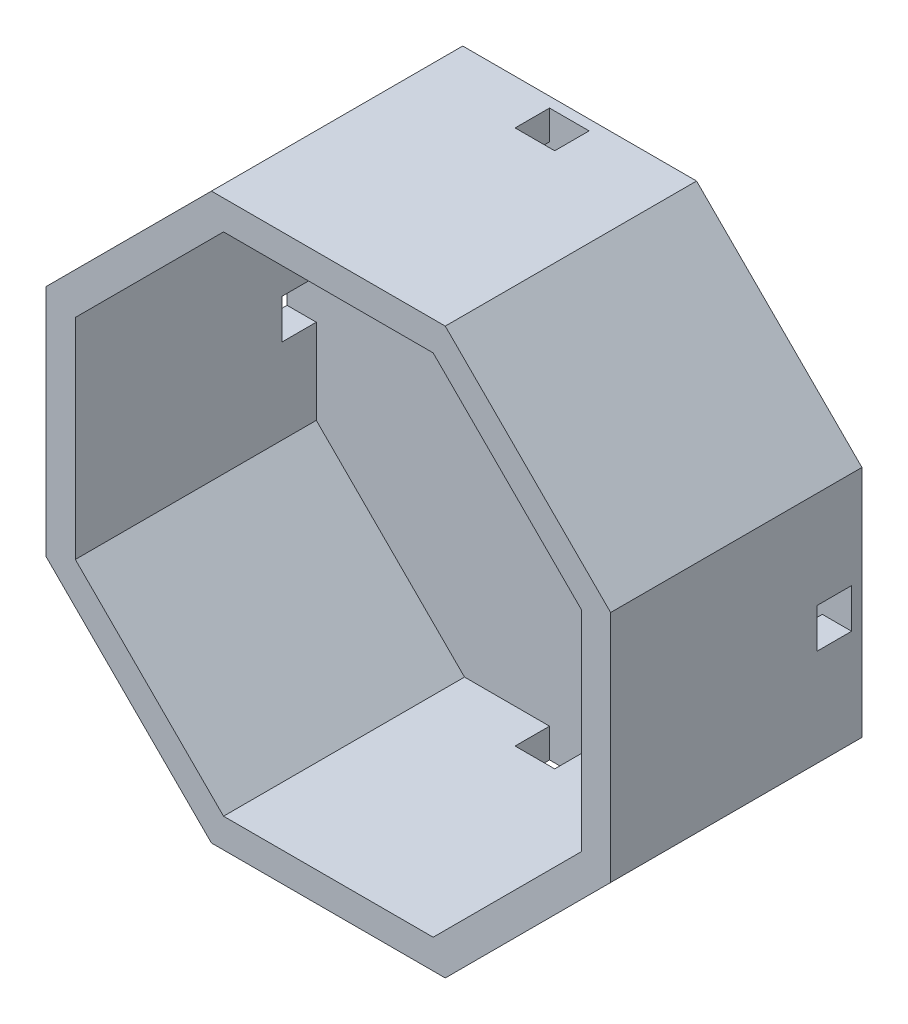
ISO-10303-21;
HEADER;
FILE_DESCRIPTION(('STEP AP214'),'2;1');
FILE_NAME('part.step','',(''),(''),'','','');
FILE_SCHEMA(('AUTOMOTIVE_DESIGN { 1 0 10303 214 1 1 1 1 }'));
ENDSEC;
DATA;
#1=APPLICATION_CONTEXT('core data for automotive mechanical design processes');
#2=APPLICATION_PROTOCOL_DEFINITION('international standard','automotive_design',2000,#1);
#3=PRODUCT_CONTEXT('',#1,'mechanical');
#4=PRODUCT('Part','Part','',(#3));
#5=PRODUCT_RELATED_PRODUCT_CATEGORY('part','',(#4));
#6=PRODUCT_DEFINITION_FORMATION('','',#4);
#7=PRODUCT_DEFINITION_CONTEXT('part definition',#1,'design');
#8=PRODUCT_DEFINITION('design','',#6,#7);
#9=PRODUCT_DEFINITION_SHAPE('','',#8);
#10=(LENGTH_UNIT() NAMED_UNIT(*) SI_UNIT(.MILLI.,.METRE.));
#11=(NAMED_UNIT(*) PLANE_ANGLE_UNIT() SI_UNIT($,.RADIAN.));
#12=(NAMED_UNIT(*) SI_UNIT($,.STERADIAN.) SOLID_ANGLE_UNIT());
#13=UNCERTAINTY_MEASURE_WITH_UNIT(LENGTH_MEASURE(1.E-05),#10,'distance_accuracy_value','');
#14=(GEOMETRIC_REPRESENTATION_CONTEXT(3) GLOBAL_UNCERTAINTY_ASSIGNED_CONTEXT((#13)) GLOBAL_UNIT_ASSIGNED_CONTEXT((#10,
#11,#12)) REPRESENTATION_CONTEXT('',''));
#15=CARTESIAN_POINT('',(0.,0.,0.));
#16=DIRECTION('',(0.,0.,1.));
#17=DIRECTION('',(1.,0.,0.));
#18=AXIS2_PLACEMENT_3D('',#15,#16,#17);
#19=CARTESIAN_POINT('',(0.,118.5,-33.4999999999997));
#20=DIRECTION('',(0.,1.,0.));
#21=DIRECTION('',(-1.,0.,0.));
#22=AXIS2_PLACEMENT_3D('',#19,#20,#21);
#23=PLANE('',#22);
#24=DIRECTION('',(1.,0.,0.));
#25=VECTOR('',#24,1.);
#26=CARTESIAN_POINT('',(0.,118.5,-36.4999999999997));
#27=LINE('',#26,#25);
#28=CARTESIAN_POINT('',(-33.9649975571363,118.5,-36.4999999999997));
#29=VERTEX_POINT('',#28);
#30=CARTESIAN_POINT('',(33.9650024428637,118.5,-36.4999999999997));
#31=VERTEX_POINT('',#30);
#32=EDGE_CURVE('E444',#29,#31,#27,.T.);
#33=ORIENTED_EDGE('',*,*,#32,.F.);
#34=DIRECTION('',(0.,0.,-1.));
#35=VECTOR('',#34,1.);
#36=CARTESIAN_POINT('',(-33.9649975571363,118.5,-33.4999999999997));
#37=LINE('',#36,#35);
#38=CARTESIAN_POINT('',(-33.9649975571363,118.5,36.5000000000003));
#39=VERTEX_POINT('',#38);
#40=EDGE_CURVE('E467',#39,#29,#37,.T.);
#41=ORIENTED_EDGE('',*,*,#40,.F.);
#42=DIRECTION('',(-1.,0.,0.));
#43=VECTOR('',#42,1.);
#44=CARTESIAN_POINT('',(0.,118.5,36.5000000000003));
#45=LINE('',#44,#43);
#46=CARTESIAN_POINT('',(33.9650024428637,118.5,36.5000000000003));
#47=VERTEX_POINT('',#46);
#48=EDGE_CURVE('E368',#47,#39,#45,.T.);
#49=ORIENTED_EDGE('',*,*,#48,.F.);
#50=DIRECTION('',(0.,0.,-1.));
#51=VECTOR('',#50,1.);
#52=CARTESIAN_POINT('',(33.9650024428637,118.5,-33.4999999999997));
#53=LINE('',#52,#51);
#54=EDGE_CURVE('E469',#47,#31,#53,.T.);
#55=ORIENTED_EDGE('',*,*,#54,.T.);
#56=EDGE_LOOP('',(#33,#41,#49,#55));
#57=FACE_BOUND('',#56,.T.);
#58=DIRECTION('',(-1.,0.,0.));
#59=VECTOR('',#58,1.);
#60=CARTESIAN_POINT('',(0.,118.5,-23.4999999999997));
#61=LINE('',#60,#59);
#62=CARTESIAN_POINT('',(5.75,118.5,-23.4999999999997));
#63=VERTEX_POINT('',#62);
#64=CARTESIAN_POINT('',(-5.75,118.5,-23.4999999999997));
#65=VERTEX_POINT('',#64);
#66=EDGE_CURVE('E258',#63,#65,#61,.T.);
#67=ORIENTED_EDGE('',*,*,#66,.T.);
#68=DIRECTION('',(0.,0.,-1.));
#69=VECTOR('',#68,1.);
#70=CARTESIAN_POINT('',(-5.75,118.5,-36.4999999999997));
#71=LINE('',#70,#69);
#72=CARTESIAN_POINT('',(-5.75,118.5,-33.4999999999997));
#73=VERTEX_POINT('',#72);
#74=EDGE_CURVE('E50',#65,#73,#71,.T.);
#75=ORIENTED_EDGE('',*,*,#74,.T.);
#76=DIRECTION('',(-1.,0.,0.));
#77=VECTOR('',#76,1.);
#78=CARTESIAN_POINT('',(0.,118.5,-33.4999999999997));
#79=LINE('',#78,#77);
#80=CARTESIAN_POINT('',(5.75,118.5,-33.4999999999997));
#81=VERTEX_POINT('',#80);
#82=EDGE_CURVE('E264',#81,#73,#79,.T.);
#83=ORIENTED_EDGE('',*,*,#82,.F.);
#84=DIRECTION('',(0.,0.,1.));
#85=VECTOR('',#84,1.);
#86=CARTESIAN_POINT('',(5.75,118.5,-36.4999999999997));
#87=LINE('',#86,#85);
#88=EDGE_CURVE('E249',#81,#63,#87,.T.);
#89=ORIENTED_EDGE('',*,*,#88,.T.);
#90=EDGE_LOOP('',(#67,#75,#83,#89));
#91=FACE_BOUND('',#90,.T.);
#92=ADVANCED_FACE('F35',(#57,#91),#23,.T.);
#93=CARTESIAN_POINT('',(0.,-45.4999999999999,-33.5000000000003));
#94=DIRECTION('',(0.,1.,0.));
#95=DIRECTION('',(-1.,0.,0.));
#96=AXIS2_PLACEMENT_3D('',#93,#94,#95);
#97=PLANE('',#96);
#98=DIRECTION('',(1.,0.,0.));
#99=VECTOR('',#98,1.);
#100=CARTESIAN_POINT('',(0.,-45.4999999999999,-36.5000000000003));
#101=LINE('',#100,#99);
#102=CARTESIAN_POINT('',(-33.9649975571363,-45.4999999999999,-36.5000000000003));
#103=VERTEX_POINT('',#102);
#104=CARTESIAN_POINT('',(33.9650024428637,-45.4999999999999,-36.5000000000003));
#105=VERTEX_POINT('',#104);
#106=EDGE_CURVE('E454',#103,#105,#101,.T.);
#107=ORIENTED_EDGE('',*,*,#106,.T.);
#108=DIRECTION('',(0.,0.,-1.));
#109=VECTOR('',#108,1.);
#110=CARTESIAN_POINT('',(33.9650024428637,-45.4999999999999,-33.5000000000003));
#111=LINE('',#110,#109);
#112=CARTESIAN_POINT('',(33.9650024428637,-45.5000000000001,36.4999999999997));
#113=VERTEX_POINT('',#112);
#114=EDGE_CURVE('E456',#113,#105,#111,.T.);
#115=ORIENTED_EDGE('',*,*,#114,.F.);
#116=DIRECTION('',(1.,0.,0.));
#117=VECTOR('',#116,1.);
#118=CARTESIAN_POINT('',(0.,-45.5000000000001,36.4999999999997));
#119=LINE('',#118,#117);
#120=CARTESIAN_POINT('',(-33.9649975571363,-45.5000000000001,36.4999999999997));
#121=VERTEX_POINT('',#120);
#122=EDGE_CURVE('E380',#121,#113,#119,.T.);
#123=ORIENTED_EDGE('',*,*,#122,.F.);
#124=DIRECTION('',(0.,0.,-1.));
#125=VECTOR('',#124,1.);
#126=CARTESIAN_POINT('',(-33.9649975571363,-45.4999999999999,-33.5000000000003));
#127=LINE('',#126,#125);
#128=EDGE_CURVE('E459',#121,#103,#127,.T.);
#129=ORIENTED_EDGE('',*,*,#128,.T.);
#130=EDGE_LOOP('',(#107,#115,#123,#129));
#131=FACE_BOUND('',#130,.T.);
#132=DIRECTION('',(0.,0.,-1.));
#133=VECTOR('',#132,1.);
#134=CARTESIAN_POINT('',(-5.75,-45.4999999999999,-33.5000000000003));
#135=LINE('',#134,#133);
#136=CARTESIAN_POINT('',(-5.75,-45.4999999999999,-23.5000000000003));
#137=VERTEX_POINT('',#136);
#138=CARTESIAN_POINT('',(-5.75,-45.4999999999999,-33.5000000000003));
#139=VERTEX_POINT('',#138);
#140=EDGE_CURVE('E287',#137,#139,#135,.T.);
#141=ORIENTED_EDGE('',*,*,#140,.F.);
#142=DIRECTION('',(-1.,0.,0.));
#143=VECTOR('',#142,1.);
#144=CARTESIAN_POINT('',(0.,-45.4999999999999,-23.5000000000003));
#145=LINE('',#144,#143);
#146=CARTESIAN_POINT('',(5.75,-45.4999999999999,-23.5000000000003));
#147=VERTEX_POINT('',#146);
#148=EDGE_CURVE('E291',#147,#137,#145,.T.);
#149=ORIENTED_EDGE('',*,*,#148,.F.);
#150=DIRECTION('',(0.,0.,1.));
#151=VECTOR('',#150,1.);
#152=CARTESIAN_POINT('',(5.75,-45.4999999999999,-33.5000000000003));
#153=LINE('',#152,#151);
#154=CARTESIAN_POINT('',(5.75,-45.4999999999999,-33.5000000000003));
#155=VERTEX_POINT('',#154);
#156=EDGE_CURVE('E280',#155,#147,#153,.T.);
#157=ORIENTED_EDGE('',*,*,#156,.F.);
#158=DIRECTION('',(-1.,0.,0.));
#159=VECTOR('',#158,1.);
#160=CARTESIAN_POINT('',(0.,-45.4999999999999,-33.5000000000003));
#161=LINE('',#160,#159);
#162=EDGE_CURVE('E293',#155,#139,#161,.T.);
#163=ORIENTED_EDGE('',*,*,#162,.T.);
#164=EDGE_LOOP('',(#141,#149,#157,#163));
#165=FACE_BOUND('',#164,.T.);
#166=ADVANCED_FACE('F528',(#131,#165),#97,.F.);
#167=CARTESIAN_POINT('',(0.,110.,36.5000000000003));
#168=DIRECTION('',(0.,1.,0.));
#169=DIRECTION('',(-1.,0.,0.));
#170=AXIS2_PLACEMENT_3D('',#167,#168,#169);
#171=PLANE('',#170);
#172=DIRECTION('',(0.,0.,-1.));
#173=VECTOR('',#172,1.);
#174=CARTESIAN_POINT('',(-5.74999999999999,110.,36.5000000000003));
#175=LINE('',#174,#173);
#176=CARTESIAN_POINT('',(-5.75,110.,-23.4999999999997));
#177=VERTEX_POINT('',#176);
#178=CARTESIAN_POINT('',(-5.75,110.,-33.4999999999997));
#179=VERTEX_POINT('',#178);
#180=EDGE_CURVE('E285',#177,#179,#175,.T.);
#181=ORIENTED_EDGE('',*,*,#180,.F.);
#182=DIRECTION('',(-1.,0.,0.));
#183=VECTOR('',#182,1.);
#184=CARTESIAN_POINT('',(0.,110.,-23.4999999999997));
#185=LINE('',#184,#183);
#186=CARTESIAN_POINT('',(5.75,110.,-23.4999999999997));
#187=VERTEX_POINT('',#186);
#188=EDGE_CURVE('E289',#187,#177,#185,.T.);
#189=ORIENTED_EDGE('',*,*,#188,.F.);
#190=DIRECTION('',(0.,0.,1.));
#191=VECTOR('',#190,1.);
#192=CARTESIAN_POINT('',(5.75000000000001,110.,36.5000000000003));
#193=LINE('',#192,#191);
#194=CARTESIAN_POINT('',(5.75,110.,-33.4999999999997));
#195=VERTEX_POINT('',#194);
#196=EDGE_CURVE('E252',#195,#187,#193,.T.);
#197=ORIENTED_EDGE('',*,*,#196,.F.);
#198=DIRECTION('',(1.,0.,0.));
#199=VECTOR('',#198,1.);
#200=CARTESIAN_POINT('',(0.,110.,-33.4999999999997));
#201=LINE('',#200,#199);
#202=CARTESIAN_POINT('',(30.4441847198287,110.,-33.4999999999997));
#203=VERTEX_POINT('',#202);
#204=EDGE_CURVE('E344',#195,#203,#201,.T.);
#205=ORIENTED_EDGE('',*,*,#204,.T.);
#206=DIRECTION('',(0.,0.,-1.));
#207=VECTOR('',#206,1.);
#208=CARTESIAN_POINT('',(30.4441847198287,110.,36.5000000000003));
#209=LINE('',#208,#207);
#210=CARTESIAN_POINT('',(30.4441847198287,110.,36.5000000000003));
#211=VERTEX_POINT('',#210);
#212=EDGE_CURVE('E432',#211,#203,#209,.T.);
#213=ORIENTED_EDGE('',*,*,#212,.F.);
#214=DIRECTION('',(1.,0.,0.));
#215=VECTOR('',#214,1.);
#216=CARTESIAN_POINT('',(0.,110.,36.5000000000003));
#217=LINE('',#216,#215);
#218=CARTESIAN_POINT('',(-30.4441847198287,110.,36.5000000000003));
#219=VERTEX_POINT('',#218);
#220=EDGE_CURVE('E345',#219,#211,#217,.T.);
#221=ORIENTED_EDGE('',*,*,#220,.F.);
#222=DIRECTION('',(0.,0.,-1.));
#223=VECTOR('',#222,1.);
#224=CARTESIAN_POINT('',(-30.4441847198287,110.,36.5000000000003));
#225=LINE('',#224,#223);
#226=CARTESIAN_POINT('',(-30.4441847198287,110.,-33.4999999999997));
#227=VERTEX_POINT('',#226);
#228=EDGE_CURVE('E389',#219,#227,#225,.T.);
#229=ORIENTED_EDGE('',*,*,#228,.T.);
#230=EDGE_CURVE('E390',#227,#179,#201,.T.);
#231=ORIENTED_EDGE('',*,*,#230,.T.);
#232=EDGE_LOOP('',(#181,#189,#197,#205,#213,#221,#229,#231));
#233=FACE_BOUND('',#232,.T.);
#234=ADVANCED_FACE('F567',(#233),#171,.F.);
#235=CARTESIAN_POINT('',(0.,-37.0000000000001,36.4999999999998));
#236=DIRECTION('',(0.,1.,0.));
#237=DIRECTION('',(-1.,0.,0.));
#238=AXIS2_PLACEMENT_3D('',#235,#236,#237);
#239=PLANE('',#238);
#240=DIRECTION('',(-1.,0.,0.));
#241=VECTOR('',#240,1.);
#242=CARTESIAN_POINT('',(0.,-36.9999999999999,-23.5000000000003));
#243=LINE('',#242,#241);
#244=CARTESIAN_POINT('',(5.75,-36.9999999999999,-23.5000000000003));
#245=VERTEX_POINT('',#244);
#246=CARTESIAN_POINT('',(-5.75,-36.9999999999999,-23.5000000000003));
#247=VERTEX_POINT('',#246);
#248=EDGE_CURVE('E11',#245,#247,#243,.T.);
#249=ORIENTED_EDGE('',*,*,#248,.T.);
#250=DIRECTION('',(0.,0.,-1.));
#251=VECTOR('',#250,1.);
#252=CARTESIAN_POINT('',(-5.74999999999999,-37.0000000000001,36.4999999999998));
#253=LINE('',#252,#251);
#254=CARTESIAN_POINT('',(-5.75,-36.9999999999999,-33.5000000000003));
#255=VERTEX_POINT('',#254);
#256=EDGE_CURVE('E282',#247,#255,#253,.T.);
#257=ORIENTED_EDGE('',*,*,#256,.T.);
#258=DIRECTION('',(1.,0.,0.));
#259=VECTOR('',#258,1.);
#260=CARTESIAN_POINT('',(0.,-36.9999999999999,-33.5000000000003));
#261=LINE('',#260,#259);
#262=CARTESIAN_POINT('',(-30.4441847198286,-36.9999999999999,-33.5000000000003));
#263=VERTEX_POINT('',#262);
#264=EDGE_CURVE('E404',#263,#255,#261,.T.);
#265=ORIENTED_EDGE('',*,*,#264,.F.);
#266=DIRECTION('',(0.,0.,-1.));
#267=VECTOR('',#266,1.);
#268=CARTESIAN_POINT('',(-30.4441847198286,-37.0000000000001,36.4999999999998));
#269=LINE('',#268,#267);
#270=CARTESIAN_POINT('',(-30.4441847198286,-37.0000000000001,36.4999999999998));
#271=VERTEX_POINT('',#270);
#272=EDGE_CURVE('E422',#271,#263,#269,.T.);
#273=ORIENTED_EDGE('',*,*,#272,.F.);
#274=DIRECTION('',(1.,0.,0.));
#275=VECTOR('',#274,1.);
#276=CARTESIAN_POINT('',(0.,-37.0000000000001,36.4999999999998));
#277=LINE('',#276,#275);
#278=CARTESIAN_POINT('',(30.4441847198287,-37.0000000000001,36.4999999999998));
#279=VERTEX_POINT('',#278);
#280=EDGE_CURVE('E356',#271,#279,#277,.T.);
#281=ORIENTED_EDGE('',*,*,#280,.T.);
#282=DIRECTION('',(0.,0.,-1.));
#283=VECTOR('',#282,1.);
#284=CARTESIAN_POINT('',(30.4441847198287,-37.0000000000001,36.4999999999998));
#285=LINE('',#284,#283);
#286=CARTESIAN_POINT('',(30.4441847198287,-36.9999999999999,-33.5000000000003));
#287=VERTEX_POINT('',#286);
#288=EDGE_CURVE('E424',#279,#287,#285,.T.);
#289=ORIENTED_EDGE('',*,*,#288,.T.);
#290=CARTESIAN_POINT('',(5.75,-36.9999999999999,-33.5000000000003));
#291=VERTEX_POINT('',#290);
#292=EDGE_CURVE('E403',#291,#287,#261,.T.);
#293=ORIENTED_EDGE('',*,*,#292,.F.);
#294=DIRECTION('',(0.,0.,1.));
#295=VECTOR('',#294,1.);
#296=CARTESIAN_POINT('',(5.75000000000001,-37.0000000000001,36.4999999999998));
#297=LINE('',#296,#295);
#298=EDGE_CURVE('E276',#291,#245,#297,.T.);
#299=ORIENTED_EDGE('',*,*,#298,.T.);
#300=EDGE_LOOP('',(#249,#257,#265,#273,#281,#289,#293,#299));
#301=FACE_BOUND('',#300,.T.);
#302=ADVANCED_FACE('F518',(#301),#239,.T.);
#303=CARTESIAN_POINT('',(57.9825020850924,-21.4824991363393,-33.5000000000002));
#304=DIRECTION('',(-0.707106799166828,0.707106763206266,0.));
#305=DIRECTION('',(-0.707106763206267,-0.707106799166828,0.));
#306=AXIS2_PLACEMENT_3D('',#303,#304,#305);
#307=PLANE('',#306);
#308=DIRECTION('',(0.707106763206267,0.707106799166828,0.));
#309=VECTOR('',#308,1.);
#310=CARTESIAN_POINT('',(57.9825020850924,-21.4824991363392,-36.5000000000002));
#311=LINE('',#310,#309);
#312=CARTESIAN_POINT('',(82.,2.5350000000002,-36.5000000000001));
#313=VERTEX_POINT('',#312);
#314=EDGE_CURVE('E435',#105,#313,#311,.T.);
#315=ORIENTED_EDGE('',*,*,#314,.T.);
#316=DIRECTION('',(0.,0.,-1.));
#317=VECTOR('',#316,1.);
#318=CARTESIAN_POINT('',(82.,2.53500000000019,-33.5000000000001));
#319=LINE('',#318,#317);
#320=CARTESIAN_POINT('',(82.,2.53499999999995,36.4999999999999));
#321=VERTEX_POINT('',#320);
#322=EDGE_CURVE('E473',#321,#313,#319,.T.);
#323=ORIENTED_EDGE('',*,*,#322,.F.);
#324=DIRECTION('',(0.707106763206267,0.707106799166828,0.));
#325=VECTOR('',#324,1.);
#326=CARTESIAN_POINT('',(57.9825020850925,-21.4824991363395,36.4999999999998));
#327=LINE('',#326,#325);
#328=EDGE_CURVE('E383',#113,#321,#327,.T.);
#329=ORIENTED_EDGE('',*,*,#328,.F.);
#330=ORIENTED_EDGE('',*,*,#114,.T.);
#331=EDGE_LOOP('',(#315,#323,#329,#330));
#332=FACE_BOUND('',#331,.T.);
#333=ADVANCED_FACE('F37',(#332),#307,.F.);
#334=CARTESIAN_POINT('',(82.,36.5000000000001,-33.5));
#335=DIRECTION('',(1.,0.,0.));
#336=DIRECTION('',(0.,1.,0.));
#337=AXIS2_PLACEMENT_3D('',#334,#335,#336);
#338=PLANE('',#337);
#339=DIRECTION('',(0.,-1.,0.));
#340=VECTOR('',#339,1.);
#341=CARTESIAN_POINT('',(82.,36.5000000000001,-23.5));
#342=LINE('',#341,#340);
#343=CARTESIAN_POINT('',(82.,42.2500000000001,-23.5));
#344=VERTEX_POINT('',#343);
#345=CARTESIAN_POINT('',(82.,30.7500000000001,-23.5));
#346=VERTEX_POINT('',#345);
#347=EDGE_CURVE('E296',#344,#346,#342,.T.);
#348=ORIENTED_EDGE('',*,*,#347,.F.);
#349=DIRECTION('',(0.,0.,1.));
#350=VECTOR('',#349,1.);
#351=CARTESIAN_POINT('',(82.,42.2500000000001,-36.5));
#352=LINE('',#351,#350);
#353=CARTESIAN_POINT('',(82.,42.2500000000001,-33.5));
#354=VERTEX_POINT('',#353);
#355=EDGE_CURVE('E304',#354,#344,#352,.T.);
#356=ORIENTED_EDGE('',*,*,#355,.F.);
#357=DIRECTION('',(0.,1.,0.));
#358=VECTOR('',#357,1.);
#359=CARTESIAN_POINT('',(82.,36.5000000000001,-33.5));
#360=LINE('',#359,#358);
#361=CARTESIAN_POINT('',(82.,30.7500000000001,-33.5));
#362=VERTEX_POINT('',#361);
#363=EDGE_CURVE('E301',#362,#354,#360,.T.);
#364=ORIENTED_EDGE('',*,*,#363,.F.);
#365=DIRECTION('',(0.,0.,-1.));
#366=VECTOR('',#365,1.);
#367=CARTESIAN_POINT('',(82.,30.7500000000001,-36.5));
#368=LINE('',#367,#366);
#369=EDGE_CURVE('E298',#346,#362,#368,.T.);
#370=ORIENTED_EDGE('',*,*,#369,.F.);
#371=EDGE_LOOP('',(#348,#356,#364,#370));
#372=FACE_BOUND('',#371,.T.);
#373=DIRECTION('',(0.,-1.,0.));
#374=VECTOR('',#373,1.);
#375=CARTESIAN_POINT('',(82.,36.5000000000001,-36.5));
#376=LINE('',#375,#374);
#377=CARTESIAN_POINT('',(82.,70.4650000000001,-36.4999999999999));
#378=VERTEX_POINT('',#377);
#379=EDGE_CURVE('E438',#378,#313,#376,.T.);
#380=ORIENTED_EDGE('',*,*,#379,.F.);
#381=DIRECTION('',(0.,0.,-1.));
#382=VECTOR('',#381,1.);
#383=CARTESIAN_POINT('',(82.,70.4650000000001,-33.4999999999999));
#384=LINE('',#383,#382);
#385=CARTESIAN_POINT('',(82.,70.4649999999999,36.5000000000001));
#386=VERTEX_POINT('',#385);
#387=EDGE_CURVE('E471',#386,#378,#384,.T.);
#388=ORIENTED_EDGE('',*,*,#387,.F.);
#389=DIRECTION('',(0.,1.,0.));
#390=VECTOR('',#389,1.);
#391=CARTESIAN_POINT('',(82.,36.4999999999999,36.5));
#392=LINE('',#391,#390);
#393=EDGE_CURVE('E386',#321,#386,#392,.T.);
#394=ORIENTED_EDGE('',*,*,#393,.F.);
#395=ORIENTED_EDGE('',*,*,#322,.T.);
#396=EDGE_LOOP('',(#380,#388,#394,#395));
#397=FACE_BOUND('',#396,.T.);
#398=ADVANCED_FACE('F554',(#372,#397),#338,.T.);
#399=CARTESIAN_POINT('',(57.9825020850924,94.4824991363396,-33.4999999999998));
#400=DIRECTION('',(0.707106799166828,0.707106763206267,0.));
#401=DIRECTION('',(-0.707106763206267,0.707106799166828,0.));
#402=AXIS2_PLACEMENT_3D('',#399,#400,#401);
#403=PLANE('',#402);
#404=DIRECTION('',(0.707106763206267,-0.707106799166828,0.));
#405=VECTOR('',#404,1.);
#406=CARTESIAN_POINT('',(57.9825020850924,94.4824991363396,-36.4999999999998));
#407=LINE('',#406,#405);
#408=EDGE_CURVE('E441',#31,#378,#407,.T.);
#409=ORIENTED_EDGE('',*,*,#408,.F.);
#410=ORIENTED_EDGE('',*,*,#54,.F.);
#411=DIRECTION('',(-0.707106763206267,0.707106799166828,0.));
#412=VECTOR('',#411,1.);
#413=CARTESIAN_POINT('',(57.9825020850924,94.4824991363393,36.5000000000002));
#414=LINE('',#413,#412);
#415=EDGE_CURVE('E365',#386,#47,#414,.T.);
#416=ORIENTED_EDGE('',*,*,#415,.F.);
#417=ORIENTED_EDGE('',*,*,#387,.T.);
#418=EDGE_LOOP('',(#409,#410,#416,#417));
#419=FACE_BOUND('',#418,.T.);
#420=ADVANCED_FACE('F594',(#419),#403,.T.);
#421=CARTESIAN_POINT('',(-57.9824979149076,94.4825008636606,-33.4999999999998));
#422=DIRECTION('',(-0.707106763206267,0.707106799166827,0.));
#423=DIRECTION('',(-0.707106799166827,-0.707106763206268,0.));
#424=AXIS2_PLACEMENT_3D('',#421,#422,#423);
#425=PLANE('',#424);
#426=DIRECTION('',(0.707106799166827,0.707106763206268,0.));
#427=VECTOR('',#426,1.);
#428=CARTESIAN_POINT('',(-57.9824979149076,94.4825008636606,-36.4999999999998));
#429=LINE('',#428,#427);
#430=CARTESIAN_POINT('',(-82.,70.4650000000001,-36.4999999999999));
#431=VERTEX_POINT('',#430);
#432=EDGE_CURVE('E447',#431,#29,#429,.T.);
#433=ORIENTED_EDGE('',*,*,#432,.F.);
#434=DIRECTION('',(0.,0.,-1.));
#435=VECTOR('',#434,1.);
#436=CARTESIAN_POINT('',(-82.,70.4650000000001,-33.4999999999999));
#437=LINE('',#436,#435);
#438=CARTESIAN_POINT('',(-82.,70.4649999999999,36.5000000000001));
#439=VERTEX_POINT('',#438);
#440=EDGE_CURVE('E465',#439,#431,#437,.T.);
#441=ORIENTED_EDGE('',*,*,#440,.F.);
#442=DIRECTION('',(-0.707106799166827,-0.707106763206268,0.));
#443=VECTOR('',#442,1.);
#444=CARTESIAN_POINT('',(-57.9824979149076,94.4825008636603,36.5000000000002));
#445=LINE('',#444,#443);
#446=EDGE_CURVE('E371',#39,#439,#445,.T.);
#447=ORIENTED_EDGE('',*,*,#446,.F.);
#448=ORIENTED_EDGE('',*,*,#40,.T.);
#449=EDGE_LOOP('',(#433,#441,#447,#448));
#450=FACE_BOUND('',#449,.T.);
#451=ADVANCED_FACE('F592',(#450),#425,.T.);
#452=CARTESIAN_POINT('',(-82.,36.5000000000001,-33.5));
#453=DIRECTION('',(1.,0.,0.));
#454=DIRECTION('',(0.,1.,0.));
#455=AXIS2_PLACEMENT_3D('',#452,#453,#454);
#456=PLANE('',#455);
#457=DIRECTION('',(0.,0.,1.));
#458=VECTOR('',#457,1.);
#459=CARTESIAN_POINT('',(-82.,42.2500000000001,-33.5));
#460=LINE('',#459,#458);
#461=CARTESIAN_POINT('',(-82.,42.2500000000001,-33.5));
#462=VERTEX_POINT('',#461);
#463=CARTESIAN_POINT('',(-82.,42.2500000000001,-23.5));
#464=VERTEX_POINT('',#463);
#465=EDGE_CURVE('E333',#462,#464,#460,.T.);
#466=ORIENTED_EDGE('',*,*,#465,.T.);
#467=DIRECTION('',(0.,-1.,0.));
#468=VECTOR('',#467,1.);
#469=CARTESIAN_POINT('',(-82.,36.5000000000001,-23.5));
#470=LINE('',#469,#468);
#471=CARTESIAN_POINT('',(-82.,30.7500000000001,-23.5));
#472=VERTEX_POINT('',#471);
#473=EDGE_CURVE('E341',#464,#472,#470,.T.);
#474=ORIENTED_EDGE('',*,*,#473,.T.);
#475=DIRECTION('',(0.,0.,-1.));
#476=VECTOR('',#475,1.);
#477=CARTESIAN_POINT('',(-82.,30.7500000000001,-33.5));
#478=LINE('',#477,#476);
#479=CARTESIAN_POINT('',(-82.,30.7500000000001,-33.5));
#480=VERTEX_POINT('',#479);
#481=EDGE_CURVE('E325',#472,#480,#478,.T.);
#482=ORIENTED_EDGE('',*,*,#481,.T.);
#483=DIRECTION('',(0.,1.,0.));
#484=VECTOR('',#483,1.);
#485=CARTESIAN_POINT('',(-82.,36.5000000000001,-33.5));
#486=LINE('',#485,#484);
#487=EDGE_CURVE('E336',#480,#462,#486,.T.);
#488=ORIENTED_EDGE('',*,*,#487,.T.);
#489=EDGE_LOOP('',(#466,#474,#482,#488));
#490=FACE_BOUND('',#489,.T.);
#491=DIRECTION('',(0.,-1.,0.));
#492=VECTOR('',#491,1.);
#493=CARTESIAN_POINT('',(-82.,36.5000000000001,-36.5));
#494=LINE('',#493,#492);
#495=CARTESIAN_POINT('',(-82.,2.53500000000013,-36.5000000000001));
#496=VERTEX_POINT('',#495);
#497=EDGE_CURVE('E450',#431,#496,#494,.T.);
#498=ORIENTED_EDGE('',*,*,#497,.T.);
#499=DIRECTION('',(0.,0.,-1.));
#500=VECTOR('',#499,1.);
#501=CARTESIAN_POINT('',(-82.,2.53500000000011,-33.5000000000001));
#502=LINE('',#501,#500);
#503=CARTESIAN_POINT('',(-82.,2.53499999999985,36.4999999999999));
#504=VERTEX_POINT('',#503);
#505=EDGE_CURVE('E462',#504,#496,#502,.T.);
#506=ORIENTED_EDGE('',*,*,#505,.F.);
#507=DIRECTION('',(0.,-1.,0.));
#508=VECTOR('',#507,1.);
#509=CARTESIAN_POINT('',(-82.,36.4999999999999,36.5));
#510=LINE('',#509,#508);
#511=EDGE_CURVE('E374',#439,#504,#510,.T.);
#512=ORIENTED_EDGE('',*,*,#511,.F.);
#513=ORIENTED_EDGE('',*,*,#440,.T.);
#514=EDGE_LOOP('',(#498,#506,#512,#513));
#515=FACE_BOUND('',#514,.T.);
#516=ADVANCED_FACE('F488',(#490,#515),#456,.F.);
#517=CARTESIAN_POINT('',(-57.9824979149077,-21.4825008636603,-33.5000000000002));
#518=DIRECTION('',(0.707106763206268,0.707106799166827,0.));
#519=DIRECTION('',(-0.707106799166827,0.707106763206268,0.));
#520=AXIS2_PLACEMENT_3D('',#517,#518,#519);
#521=PLANE('',#520);
#522=DIRECTION('',(0.707106799166827,-0.707106763206268,0.));
#523=VECTOR('',#522,1.);
#524=CARTESIAN_POINT('',(-57.9824979149077,-21.4825008636603,-36.5000000000002));
#525=LINE('',#524,#523);
#526=EDGE_CURVE('E452',#496,#103,#525,.T.);
#527=ORIENTED_EDGE('',*,*,#526,.T.);
#528=ORIENTED_EDGE('',*,*,#128,.F.);
#529=DIRECTION('',(0.707106799166827,-0.707106763206268,0.));
#530=VECTOR('',#529,1.);
#531=CARTESIAN_POINT('',(-57.9824979149077,-21.4825008636606,36.4999999999998));
#532=LINE('',#531,#530);
#533=EDGE_CURVE('E377',#504,#121,#532,.T.);
#534=ORIENTED_EDGE('',*,*,#533,.F.);
#535=ORIENTED_EDGE('',*,*,#505,.T.);
#536=EDGE_LOOP('',(#527,#528,#534,#535));
#537=FACE_BOUND('',#536,.T.);
#538=ADVANCED_FACE('F623',(#537),#521,.F.);
#539=CARTESIAN_POINT('',(0.,36.5000000000001,-36.5));
#540=DIRECTION('',(0.,0.,1.));
#541=DIRECTION('',(0.,-1.,0.));
#542=AXIS2_PLACEMENT_3D('',#539,#540,#541);
#543=PLANE('',#542);
#544=ORIENTED_EDGE('',*,*,#314,.F.);
#545=ORIENTED_EDGE('',*,*,#106,.F.);
#546=ORIENTED_EDGE('',*,*,#526,.F.);
#547=ORIENTED_EDGE('',*,*,#497,.F.);
#548=ORIENTED_EDGE('',*,*,#432,.T.);
#549=ORIENTED_EDGE('',*,*,#32,.T.);
#550=ORIENTED_EDGE('',*,*,#408,.T.);
#551=ORIENTED_EDGE('',*,*,#379,.T.);
#552=EDGE_LOOP('',(#544,#545,#546,#547,#548,#549,#550,#551));
#553=FACE_BOUND('',#552,.T.);
#554=ADVANCED_FACE('F611',(#553),#543,.F.);
#555=CARTESIAN_POINT('',(51.9720923599143,88.4720923599142,36.5000000000002));
#556=DIRECTION('',(0.707106781186548,0.707106781186548,0.));
#557=DIRECTION('',(-0.707106781186547,0.707106781186548,0.));
#558=AXIS2_PLACEMENT_3D('',#555,#556,#557);
#559=PLANE('',#558);
#560=DIRECTION('',(0.707106781186547,-0.707106781186548,0.));
#561=VECTOR('',#560,1.);
#562=CARTESIAN_POINT('',(51.9720923599143,88.4720923599145,-33.4999999999998));
#563=LINE('',#562,#561);
#564=CARTESIAN_POINT('',(73.5,66.9441847198288,-33.4999999999999));
#565=VERTEX_POINT('',#564);
#566=EDGE_CURVE('E393',#203,#565,#563,.T.);
#567=ORIENTED_EDGE('',*,*,#566,.T.);
#568=DIRECTION('',(0.,0.,-1.));
#569=VECTOR('',#568,1.);
#570=CARTESIAN_POINT('',(73.5,66.9441847198286,36.5000000000001));
#571=LINE('',#570,#569);
#572=CARTESIAN_POINT('',(73.5,66.9441847198286,36.5000000000001));
#573=VERTEX_POINT('',#572);
#574=EDGE_CURVE('E429',#573,#565,#571,.T.);
#575=ORIENTED_EDGE('',*,*,#574,.F.);
#576=DIRECTION('',(0.707106781186547,-0.707106781186548,0.));
#577=VECTOR('',#576,1.);
#578=CARTESIAN_POINT('',(51.9720923599143,88.4720923599142,36.5000000000002));
#579=LINE('',#578,#577);
#580=EDGE_CURVE('E348',#211,#573,#579,.T.);
#581=ORIENTED_EDGE('',*,*,#580,.F.);
#582=ORIENTED_EDGE('',*,*,#212,.T.);
#583=EDGE_LOOP('',(#567,#575,#581,#582));
#584=FACE_BOUND('',#583,.T.);
#585=ADVANCED_FACE('F564',(#584),#559,.F.);
#586=CARTESIAN_POINT('',(73.5,36.4999999999999,36.5));
#587=DIRECTION('',(-1.,0.,0.));
#588=DIRECTION('',(0.,-1.,0.));
#589=AXIS2_PLACEMENT_3D('',#586,#587,#588);
#590=PLANE('',#589);
#591=DIRECTION('',(0.,0.,-1.));
#592=VECTOR('',#591,1.);
#593=CARTESIAN_POINT('',(73.5,42.2499999999999,36.5));
#594=LINE('',#593,#592);
#595=CARTESIAN_POINT('',(73.5,42.2500000000001,-23.5));
#596=VERTEX_POINT('',#595);
#597=CARTESIAN_POINT('',(73.5,42.2500000000001,-33.5));
#598=VERTEX_POINT('',#597);
#599=EDGE_CURVE('E331',#596,#598,#594,.T.);
#600=ORIENTED_EDGE('',*,*,#599,.F.);
#601=DIRECTION('',(0.,1.,0.));
#602=VECTOR('',#601,1.);
#603=CARTESIAN_POINT('',(73.5,36.5000000000001,-23.5));
#604=LINE('',#603,#602);
#605=CARTESIAN_POINT('',(73.5,30.7500000000001,-23.5));
#606=VERTEX_POINT('',#605);
#607=EDGE_CURVE('E339',#606,#596,#604,.T.);
#608=ORIENTED_EDGE('',*,*,#607,.F.);
#609=DIRECTION('',(0.,0.,1.));
#610=VECTOR('',#609,1.);
#611=CARTESIAN_POINT('',(73.5,30.7499999999999,36.5));
#612=LINE('',#611,#610);
#613=CARTESIAN_POINT('',(73.5,30.7500000000001,-33.5));
#614=VERTEX_POINT('',#613);
#615=EDGE_CURVE('E323',#614,#606,#612,.T.);
#616=ORIENTED_EDGE('',*,*,#615,.F.);
#617=DIRECTION('',(0.,1.,0.));
#618=VECTOR('',#617,1.);
#619=CARTESIAN_POINT('',(73.5,36.5000000000001,-33.5));
#620=LINE('',#619,#618);
#621=CARTESIAN_POINT('',(73.5,6.05581528017143,-33.5000000000001));
#622=VERTEX_POINT('',#621);
#623=EDGE_CURVE('E397',#622,#614,#620,.T.);
#624=ORIENTED_EDGE('',*,*,#623,.F.);
#625=DIRECTION('',(0.,0.,-1.));
#626=VECTOR('',#625,1.);
#627=CARTESIAN_POINT('',(73.5,6.05581528017119,36.4999999999999));
#628=LINE('',#627,#626);
#629=CARTESIAN_POINT('',(73.5,6.05581528017119,36.4999999999999));
#630=VERTEX_POINT('',#629);
#631=EDGE_CURVE('E427',#630,#622,#628,.T.);
#632=ORIENTED_EDGE('',*,*,#631,.F.);
#633=DIRECTION('',(0.,1.,0.));
#634=VECTOR('',#633,1.);
#635=CARTESIAN_POINT('',(73.5,36.4999999999999,36.5));
#636=LINE('',#635,#634);
#637=EDGE_CURVE('E351',#630,#573,#636,.T.);
#638=ORIENTED_EDGE('',*,*,#637,.T.);
#639=ORIENTED_EDGE('',*,*,#574,.T.);
#640=EDGE_CURVE('E396',#598,#565,#620,.T.);
#641=ORIENTED_EDGE('',*,*,#640,.F.);
#642=EDGE_LOOP('',(#600,#608,#616,#624,#632,#638,#639,#641));
#643=FACE_BOUND('',#642,.T.);
#644=ADVANCED_FACE('F542',(#643),#590,.T.);
#645=CARTESIAN_POINT('',(51.9720923599143,-15.4720923599145,36.4999999999998));
#646=DIRECTION('',(0.707106781186548,-0.707106781186548,0.));
#647=DIRECTION('',(0.707106781186547,0.707106781186548,0.));
#648=AXIS2_PLACEMENT_3D('',#645,#646,#647);
#649=PLANE('',#648);
#650=DIRECTION('',(-0.707106781186547,-0.707106781186548,0.));
#651=VECTOR('',#650,1.);
#652=CARTESIAN_POINT('',(51.9720923599143,-15.4720923599142,-33.5000000000002));
#653=LINE('',#652,#651);
#654=EDGE_CURVE('E400',#622,#287,#653,.T.);
#655=ORIENTED_EDGE('',*,*,#654,.T.);
#656=ORIENTED_EDGE('',*,*,#288,.F.);
#657=DIRECTION('',(-0.707106781186547,-0.707106781186548,0.));
#658=VECTOR('',#657,1.);
#659=CARTESIAN_POINT('',(51.9720923599143,-15.4720923599145,36.4999999999998));
#660=LINE('',#659,#658);
#661=EDGE_CURVE('E354',#630,#279,#660,.T.);
#662=ORIENTED_EDGE('',*,*,#661,.F.);
#663=ORIENTED_EDGE('',*,*,#631,.T.);
#664=EDGE_LOOP('',(#655,#656,#662,#663));
#665=FACE_BOUND('',#664,.T.);
#666=ADVANCED_FACE('F537',(#665),#649,.F.);
#667=CARTESIAN_POINT('',(-51.9720923599143,-15.4720923599145,36.4999999999998));
#668=DIRECTION('',(-0.707106781186547,-0.707106781186548,0.));
#669=DIRECTION('',(0.707106781186548,-0.707106781186547,0.));
#670=AXIS2_PLACEMENT_3D('',#667,#668,#669);
#671=PLANE('',#670);
#672=DIRECTION('',(-0.707106781186548,0.707106781186547,0.));
#673=VECTOR('',#672,1.);
#674=CARTESIAN_POINT('',(-51.9720923599143,-15.4720923599143,-33.5000000000002));
#675=LINE('',#674,#673);
#676=CARTESIAN_POINT('',(-73.5,6.05581528017143,-33.5000000000001));
#677=VERTEX_POINT('',#676);
#678=EDGE_CURVE('E407',#263,#677,#675,.T.);
#679=ORIENTED_EDGE('',*,*,#678,.T.);
#680=DIRECTION('',(0.,0.,-1.));
#681=VECTOR('',#680,1.);
#682=CARTESIAN_POINT('',(-73.5,6.05581528017119,36.4999999999999));
#683=LINE('',#682,#681);
#684=CARTESIAN_POINT('',(-73.5,6.05581528017119,36.4999999999999));
#685=VERTEX_POINT('',#684);
#686=EDGE_CURVE('E419',#685,#677,#683,.T.);
#687=ORIENTED_EDGE('',*,*,#686,.F.);
#688=DIRECTION('',(-0.707106781186548,0.707106781186547,0.));
#689=VECTOR('',#688,1.);
#690=CARTESIAN_POINT('',(-51.9720923599143,-15.4720923599145,36.4999999999998));
#691=LINE('',#690,#689);
#692=EDGE_CURVE('E359',#271,#685,#691,.T.);
#693=ORIENTED_EDGE('',*,*,#692,.F.);
#694=ORIENTED_EDGE('',*,*,#272,.T.);
#695=EDGE_LOOP('',(#679,#687,#693,#694));
#696=FACE_BOUND('',#695,.T.);
#697=ADVANCED_FACE('F516',(#696),#671,.F.);
#698=CARTESIAN_POINT('',(-73.5,36.4999999999999,36.5));
#699=DIRECTION('',(-1.,0.,0.));
#700=DIRECTION('',(0.,-1.,0.));
#701=AXIS2_PLACEMENT_3D('',#698,#699,#700);
#702=PLANE('',#701);
#703=DIRECTION('',(0.,1.,0.));
#704=VECTOR('',#703,1.);
#705=CARTESIAN_POINT('',(-73.5,36.5000000000001,-23.5));
#706=LINE('',#705,#704);
#707=CARTESIAN_POINT('',(-73.5,30.7500000000001,-23.5));
#708=VERTEX_POINT('',#707);
#709=CARTESIAN_POINT('',(-73.5,42.2500000000001,-23.5));
#710=VERTEX_POINT('',#709);
#711=EDGE_CURVE('E43',#708,#710,#706,.T.);
#712=ORIENTED_EDGE('',*,*,#711,.T.);
#713=DIRECTION('',(0.,0.,-1.));
#714=VECTOR('',#713,1.);
#715=CARTESIAN_POINT('',(-73.5,42.2499999999999,36.5));
#716=LINE('',#715,#714);
#717=CARTESIAN_POINT('',(-73.5,42.2500000000001,-33.5));
#718=VERTEX_POINT('',#717);
#719=EDGE_CURVE('E328',#710,#718,#716,.T.);
#720=ORIENTED_EDGE('',*,*,#719,.T.);
#721=DIRECTION('',(0.,1.,0.));
#722=VECTOR('',#721,1.);
#723=CARTESIAN_POINT('',(-73.5,36.5000000000001,-33.5));
#724=LINE('',#723,#722);
#725=CARTESIAN_POINT('',(-73.5,66.9441847198288,-33.4999999999999));
#726=VERTEX_POINT('',#725);
#727=EDGE_CURVE('E409',#718,#726,#724,.T.);
#728=ORIENTED_EDGE('',*,*,#727,.T.);
#729=DIRECTION('',(0.,0.,-1.));
#730=VECTOR('',#729,1.);
#731=CARTESIAN_POINT('',(-73.5,66.9441847198286,36.5000000000001));
#732=LINE('',#731,#730);
#733=CARTESIAN_POINT('',(-73.5,66.9441847198286,36.5000000000001));
#734=VERTEX_POINT('',#733);
#735=EDGE_CURVE('E416',#734,#726,#732,.T.);
#736=ORIENTED_EDGE('',*,*,#735,.F.);
#737=DIRECTION('',(0.,1.,0.));
#738=VECTOR('',#737,1.);
#739=CARTESIAN_POINT('',(-73.5,36.4999999999999,36.5));
#740=LINE('',#739,#738);
#741=EDGE_CURVE('E361',#685,#734,#740,.T.);
#742=ORIENTED_EDGE('',*,*,#741,.F.);
#743=ORIENTED_EDGE('',*,*,#686,.T.);
#744=CARTESIAN_POINT('',(-73.5,30.7500000000001,-33.5));
#745=VERTEX_POINT('',#744);
#746=EDGE_CURVE('E410',#677,#745,#724,.T.);
#747=ORIENTED_EDGE('',*,*,#746,.T.);
#748=DIRECTION('',(0.,0.,1.));
#749=VECTOR('',#748,1.);
#750=CARTESIAN_POINT('',(-73.5,30.7499999999999,36.5));
#751=LINE('',#750,#749);
#752=EDGE_CURVE('E320',#745,#708,#751,.T.);
#753=ORIENTED_EDGE('',*,*,#752,.T.);
#754=EDGE_LOOP('',(#712,#720,#728,#736,#742,#743,#747,#753));
#755=FACE_BOUND('',#754,.T.);
#756=ADVANCED_FACE('F477',(#755),#702,.F.);
#757=CARTESIAN_POINT('',(-51.9720923599143,88.4720923599142,36.5000000000002));
#758=DIRECTION('',(-0.707106781186548,0.707106781186548,0.));
#759=DIRECTION('',(-0.707106781186548,-0.707106781186548,0.));
#760=AXIS2_PLACEMENT_3D('',#757,#758,#759);
#761=PLANE('',#760);
#762=DIRECTION('',(0.707106781186548,0.707106781186548,0.));
#763=VECTOR('',#762,1.);
#764=CARTESIAN_POINT('',(-51.9720923599143,88.4720923599145,-33.4999999999998));
#765=LINE('',#764,#763);
#766=EDGE_CURVE('E349',#726,#227,#765,.T.);
#767=ORIENTED_EDGE('',*,*,#766,.T.);
#768=ORIENTED_EDGE('',*,*,#228,.F.);
#769=DIRECTION('',(0.707106781186548,0.707106781186548,0.));
#770=VECTOR('',#769,1.);
#771=CARTESIAN_POINT('',(-51.9720923599143,88.4720923599142,36.5000000000002));
#772=LINE('',#771,#770);
#773=EDGE_CURVE('E363',#734,#219,#772,.T.);
#774=ORIENTED_EDGE('',*,*,#773,.F.);
#775=ORIENTED_EDGE('',*,*,#735,.T.);
#776=EDGE_LOOP('',(#767,#768,#774,#775));
#777=FACE_BOUND('',#776,.T.);
#778=ADVANCED_FACE('F502',(#777),#761,.F.);
#779=CARTESIAN_POINT('',(0.,36.4999999999999,36.5));
#780=DIRECTION('',(0.,0.,1.));
#781=DIRECTION('',(0.,-1.,0.));
#782=AXIS2_PLACEMENT_3D('',#779,#780,#781);
#783=PLANE('',#782);
#784=ORIENTED_EDGE('',*,*,#220,.T.);
#785=ORIENTED_EDGE('',*,*,#580,.T.);
#786=ORIENTED_EDGE('',*,*,#637,.F.);
#787=ORIENTED_EDGE('',*,*,#661,.T.);
#788=ORIENTED_EDGE('',*,*,#280,.F.);
#789=ORIENTED_EDGE('',*,*,#692,.T.);
#790=ORIENTED_EDGE('',*,*,#741,.T.);
#791=ORIENTED_EDGE('',*,*,#773,.T.);
#792=EDGE_LOOP('',(#784,#785,#786,#787,#788,#789,#790,#791));
#793=FACE_BOUND('',#792,.T.);
#794=ORIENTED_EDGE('',*,*,#415,.T.);
#795=ORIENTED_EDGE('',*,*,#48,.T.);
#796=ORIENTED_EDGE('',*,*,#446,.T.);
#797=ORIENTED_EDGE('',*,*,#511,.T.);
#798=ORIENTED_EDGE('',*,*,#533,.T.);
#799=ORIENTED_EDGE('',*,*,#122,.T.);
#800=ORIENTED_EDGE('',*,*,#328,.T.);
#801=ORIENTED_EDGE('',*,*,#393,.T.);
#802=EDGE_LOOP('',(#794,#795,#796,#797,#798,#799,#800,#801));
#803=FACE_BOUND('',#802,.T.);
#804=ADVANCED_FACE('F506',(#793,#803),#783,.T.);
#805=CARTESIAN_POINT('',(0.,36.5000000000001,-33.5));
#806=DIRECTION('',(0.,0.,1.));
#807=DIRECTION('',(0.,-1.,0.));
#808=AXIS2_PLACEMENT_3D('',#805,#806,#807);
#809=PLANE('',#808);
#810=ORIENTED_EDGE('',*,*,#204,.F.);
#811=DIRECTION('',(0.,1.,0.));
#812=VECTOR('',#811,1.);
#813=CARTESIAN_POINT('',(5.75,-51.4999999999999,-33.5000000000003));
#814=LINE('',#813,#812);
#815=EDGE_CURVE('E273',#195,#81,#814,.T.);
#816=ORIENTED_EDGE('',*,*,#815,.T.);
#817=ORIENTED_EDGE('',*,*,#82,.T.);
#818=DIRECTION('',(0.,1.,0.));
#819=VECTOR('',#818,1.);
#820=CARTESIAN_POINT('',(-5.75,-51.4999999999999,-33.5000000000003));
#821=LINE('',#820,#819);
#822=EDGE_CURVE('E269',#179,#73,#821,.T.);
#823=ORIENTED_EDGE('',*,*,#822,.F.);
#824=ORIENTED_EDGE('',*,*,#230,.F.);
#825=ORIENTED_EDGE('',*,*,#766,.F.);
#826=ORIENTED_EDGE('',*,*,#727,.F.);
#827=DIRECTION('',(1.,0.,0.));
#828=VECTOR('',#827,1.);
#829=CARTESIAN_POINT('',(-88.,42.2500000000001,-33.5));
#830=LINE('',#829,#828);
#831=EDGE_CURVE('E311',#462,#718,#830,.T.);
#832=ORIENTED_EDGE('',*,*,#831,.F.);
#833=ORIENTED_EDGE('',*,*,#487,.F.);
#834=DIRECTION('',(1.,0.,0.));
#835=VECTOR('',#834,1.);
#836=CARTESIAN_POINT('',(-88.,30.7500000000001,-33.5));
#837=LINE('',#836,#835);
#838=EDGE_CURVE('E314',#480,#745,#837,.T.);
#839=ORIENTED_EDGE('',*,*,#838,.T.);
#840=ORIENTED_EDGE('',*,*,#746,.F.);
#841=ORIENTED_EDGE('',*,*,#678,.F.);
#842=ORIENTED_EDGE('',*,*,#264,.T.);
#843=EDGE_CURVE('E271',#139,#255,#821,.T.);
#844=ORIENTED_EDGE('',*,*,#843,.F.);
#845=ORIENTED_EDGE('',*,*,#162,.F.);
#846=EDGE_CURVE('E272',#155,#291,#814,.T.);
#847=ORIENTED_EDGE('',*,*,#846,.T.);
#848=ORIENTED_EDGE('',*,*,#292,.T.);
#849=ORIENTED_EDGE('',*,*,#654,.F.);
#850=ORIENTED_EDGE('',*,*,#623,.T.);
#851=EDGE_CURVE('E315',#614,#362,#837,.T.);
#852=ORIENTED_EDGE('',*,*,#851,.T.);
#853=ORIENTED_EDGE('',*,*,#363,.T.);
#854=EDGE_CURVE('E312',#598,#354,#830,.T.);
#855=ORIENTED_EDGE('',*,*,#854,.F.);
#856=ORIENTED_EDGE('',*,*,#640,.T.);
#857=ORIENTED_EDGE('',*,*,#566,.F.);
#858=EDGE_LOOP('',(#810,#816,#817,#823,#824,#825,#826,#832,#833,#839,#840,#841,#842,#844,#845,
#847,#848,#849,#850,#852,#853,#855,#856,#857));
#859=FACE_BOUND('',#858,.T.);
#860=ADVANCED_FACE('F494',(#859),#809,.T.);
#861=CARTESIAN_POINT('',(-88.,30.7500000000001,-36.5));
#862=DIRECTION('',(0.,-1.,0.));
#863=DIRECTION('',(1.,0.,0.));
#864=AXIS2_PLACEMENT_3D('',#861,#862,#863);
#865=PLANE('',#864);
#866=DIRECTION('',(1.,0.,0.));
#867=VECTOR('',#866,1.);
#868=CARTESIAN_POINT('',(-88.,30.7500000000001,-23.5));
#869=LINE('',#868,#867);
#870=EDGE_CURVE('E317',#472,#708,#869,.T.);
#871=ORIENTED_EDGE('',*,*,#870,.T.);
#872=ORIENTED_EDGE('',*,*,#752,.F.);
#873=ORIENTED_EDGE('',*,*,#838,.F.);
#874=ORIENTED_EDGE('',*,*,#481,.F.);
#875=EDGE_LOOP('',(#871,#872,#873,#874));
#876=FACE_BOUND('',#875,.T.);
#877=ADVANCED_FACE('F636',(#876),#865,.F.);
#878=CARTESIAN_POINT('',(-88.,42.2500000000001,-36.5));
#879=DIRECTION('',(0.,1.,0.));
#880=DIRECTION('',(-1.,0.,0.));
#881=AXIS2_PLACEMENT_3D('',#878,#879,#880);
#882=PLANE('',#881);
#883=ORIENTED_EDGE('',*,*,#831,.T.);
#884=ORIENTED_EDGE('',*,*,#719,.F.);
#885=DIRECTION('',(1.,0.,0.));
#886=VECTOR('',#885,1.);
#887=CARTESIAN_POINT('',(-88.,42.2500000000001,-23.5));
#888=LINE('',#887,#886);
#889=EDGE_CURVE('E310',#464,#710,#888,.T.);
#890=ORIENTED_EDGE('',*,*,#889,.F.);
#891=ORIENTED_EDGE('',*,*,#465,.F.);
#892=EDGE_LOOP('',(#883,#884,#890,#891));
#893=FACE_BOUND('',#892,.T.);
#894=ADVANCED_FACE('F485',(#893),#882,.F.);
#895=CARTESIAN_POINT('',(-88.,36.5000000000001,-23.5));
#896=DIRECTION('',(0.,0.,1.));
#897=DIRECTION('',(0.,-1.,0.));
#898=AXIS2_PLACEMENT_3D('',#895,#896,#897);
#899=PLANE('',#898);
#900=ORIENTED_EDGE('',*,*,#889,.T.);
#901=ORIENTED_EDGE('',*,*,#711,.F.);
#902=ORIENTED_EDGE('',*,*,#870,.F.);
#903=ORIENTED_EDGE('',*,*,#473,.F.);
#904=EDGE_LOOP('',(#900,#901,#902,#903));
#905=FACE_BOUND('',#904,.T.);
#906=ADVANCED_FACE('F482',(#905),#899,.F.);
#907=ORIENTED_EDGE('',*,*,#607,.T.);
#908=EDGE_CURVE('E308',#596,#344,#888,.T.);
#909=ORIENTED_EDGE('',*,*,#908,.T.);
#910=ORIENTED_EDGE('',*,*,#347,.T.);
#911=EDGE_CURVE('E307',#606,#346,#869,.T.);
#912=ORIENTED_EDGE('',*,*,#911,.F.);
#913=EDGE_LOOP('',(#907,#909,#910,#912));
#914=FACE_BOUND('',#913,.T.);
#915=ADVANCED_FACE('F549',(#914),#899,.F.);
#916=ORIENTED_EDGE('',*,*,#599,.T.);
#917=ORIENTED_EDGE('',*,*,#854,.T.);
#918=ORIENTED_EDGE('',*,*,#355,.T.);
#919=ORIENTED_EDGE('',*,*,#908,.F.);
#920=EDGE_LOOP('',(#916,#917,#918,#919));
#921=FACE_BOUND('',#920,.T.);
#922=ADVANCED_FACE('F655',(#921),#882,.F.);
#923=ORIENTED_EDGE('',*,*,#615,.T.);
#924=ORIENTED_EDGE('',*,*,#911,.T.);
#925=ORIENTED_EDGE('',*,*,#369,.T.);
#926=ORIENTED_EDGE('',*,*,#851,.F.);
#927=EDGE_LOOP('',(#923,#924,#925,#926));
#928=FACE_BOUND('',#927,.T.);
#929=ADVANCED_FACE('F546',(#928),#865,.F.);
#930=CARTESIAN_POINT('',(0.,-51.4999999999999,-23.5000000000003));
#931=DIRECTION('',(0.,0.,-1.));
#932=DIRECTION('',(1.,0.,0.));
#933=AXIS2_PLACEMENT_3D('',#930,#931,#932);
#934=PLANE('',#933);
#935=ORIENTED_EDGE('',*,*,#148,.T.);
#936=DIRECTION('',(0.,1.,0.));
#937=VECTOR('',#936,1.);
#938=CARTESIAN_POINT('',(-5.75,-51.4999999999999,-23.5000000000003));
#939=LINE('',#938,#937);
#940=EDGE_CURVE('E255',#137,#247,#939,.T.);
#941=ORIENTED_EDGE('',*,*,#940,.T.);
#942=ORIENTED_EDGE('',*,*,#248,.F.);
#943=DIRECTION('',(0.,1.,0.));
#944=VECTOR('',#943,1.);
#945=CARTESIAN_POINT('',(5.75,-51.4999999999999,-23.5000000000003));
#946=LINE('',#945,#944);
#947=EDGE_CURVE('E58',#147,#245,#946,.T.);
#948=ORIENTED_EDGE('',*,*,#947,.F.);
#949=EDGE_LOOP('',(#935,#941,#942,#948));
#950=FACE_BOUND('',#949,.T.);
#951=ADVANCED_FACE('F578',(#950),#934,.T.);
#952=CARTESIAN_POINT('',(5.75,-51.4999999999999,-36.5000000000003));
#953=DIRECTION('',(-1.,0.,0.));
#954=DIRECTION('',(0.,0.,-1.));
#955=AXIS2_PLACEMENT_3D('',#952,#953,#954);
#956=PLANE('',#955);
#957=ORIENTED_EDGE('',*,*,#156,.T.);
#958=ORIENTED_EDGE('',*,*,#947,.T.);
#959=ORIENTED_EDGE('',*,*,#298,.F.);
#960=ORIENTED_EDGE('',*,*,#846,.F.);
#961=EDGE_LOOP('',(#957,#958,#959,#960));
#962=FACE_BOUND('',#961,.T.);
#963=ADVANCED_FACE('F531',(#962),#956,.T.);
#964=CARTESIAN_POINT('',(-5.75,-51.4999999999999,-36.5000000000003));
#965=DIRECTION('',(1.,0.,0.));
#966=DIRECTION('',(0.,0.,1.));
#967=AXIS2_PLACEMENT_3D('',#964,#965,#966);
#968=PLANE('',#967);
#969=ORIENTED_EDGE('',*,*,#140,.T.);
#970=ORIENTED_EDGE('',*,*,#843,.T.);
#971=ORIENTED_EDGE('',*,*,#256,.F.);
#972=ORIENTED_EDGE('',*,*,#940,.F.);
#973=EDGE_LOOP('',(#969,#970,#971,#972));
#974=FACE_BOUND('',#973,.T.);
#975=ADVANCED_FACE('F522',(#974),#968,.T.);
#976=ORIENTED_EDGE('',*,*,#188,.T.);
#977=EDGE_CURVE('E260',#177,#65,#939,.T.);
#978=ORIENTED_EDGE('',*,*,#977,.T.);
#979=ORIENTED_EDGE('',*,*,#66,.F.);
#980=EDGE_CURVE('E245',#187,#63,#946,.T.);
#981=ORIENTED_EDGE('',*,*,#980,.F.);
#982=EDGE_LOOP('',(#976,#978,#979,#981));
#983=FACE_BOUND('',#982,.T.);
#984=ADVANCED_FACE('F259',(#983),#934,.T.);
#985=ORIENTED_EDGE('',*,*,#180,.T.);
#986=ORIENTED_EDGE('',*,*,#822,.T.);
#987=ORIENTED_EDGE('',*,*,#74,.F.);
#988=ORIENTED_EDGE('',*,*,#977,.F.);
#989=EDGE_LOOP('',(#985,#986,#987,#988));
#990=FACE_BOUND('',#989,.T.);
#991=ADVANCED_FACE('F568',(#990),#968,.T.);
#992=ORIENTED_EDGE('',*,*,#196,.T.);
#993=ORIENTED_EDGE('',*,*,#980,.T.);
#994=ORIENTED_EDGE('',*,*,#88,.F.);
#995=ORIENTED_EDGE('',*,*,#815,.F.);
#996=EDGE_LOOP('',(#992,#993,#994,#995));
#997=FACE_BOUND('',#996,.T.);
#998=ADVANCED_FACE('F247',(#997),#956,.T.);
#999=CLOSED_SHELL('',(#92,#166,#234,#302,#333,#398,#420,#451,#516,#538,#554,#585,#644,#666,#697,
#756,#778,#804,#860,#877,#894,#906,#915,#922,#929,#951,#963,#975,#984,#991,#998));
#1000=MANIFOLD_SOLID_BREP('B2',#999);
#1001=ADVANCED_BREP_SHAPE_REPRESENTATION('',(#18,#1000),#14);
#1002=SHAPE_DEFINITION_REPRESENTATION(#9,#1001);
ENDSEC;
END-ISO-10303-21;
